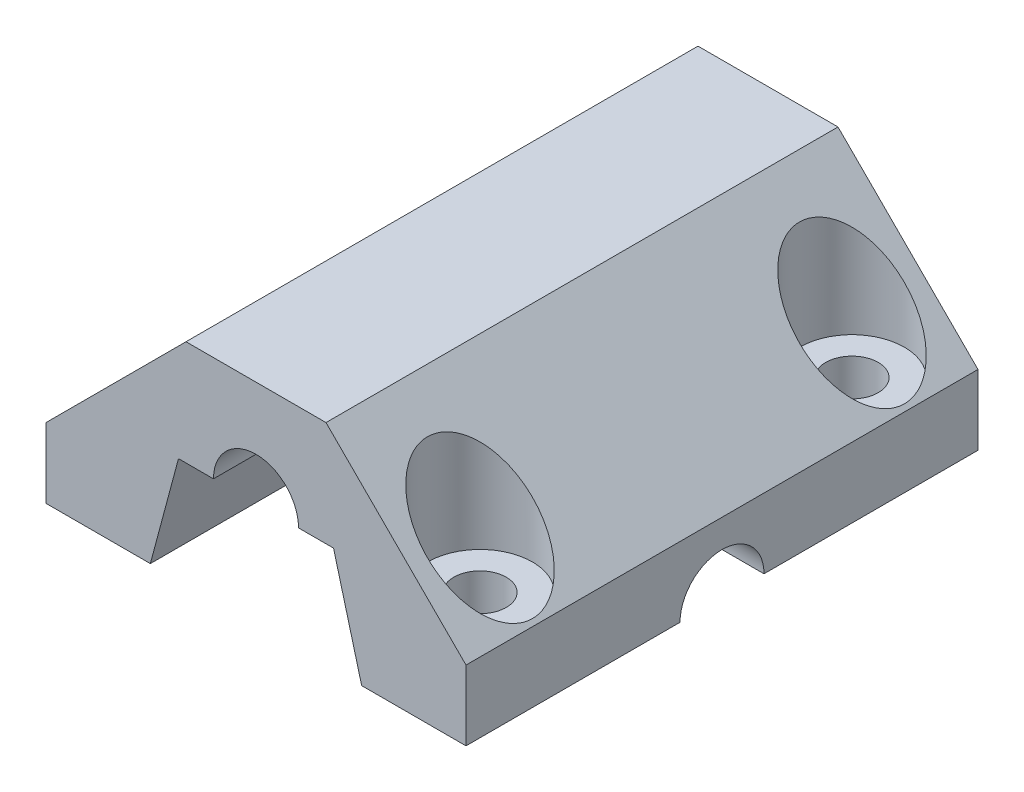
ISO-10303-21;
HEADER;
FILE_DESCRIPTION(('STEP AP214'),'2;1');
FILE_NAME('part.step','',(''),(''),'','','');
FILE_SCHEMA(('AUTOMOTIVE_DESIGN { 1 0 10303 214 1 1 1 1 }'));
ENDSEC;
DATA;
#1=APPLICATION_CONTEXT('core data for automotive mechanical design processes');
#2=APPLICATION_PROTOCOL_DEFINITION('international standard','automotive_design',2000,#1);
#3=PRODUCT_CONTEXT('',#1,'mechanical');
#4=PRODUCT('Part','Part','',(#3));
#5=PRODUCT_RELATED_PRODUCT_CATEGORY('part','',(#4));
#6=PRODUCT_DEFINITION_FORMATION('','',#4);
#7=PRODUCT_DEFINITION_CONTEXT('part definition',#1,'design');
#8=PRODUCT_DEFINITION('design','',#6,#7);
#9=PRODUCT_DEFINITION_SHAPE('','',#8);
#10=(LENGTH_UNIT() NAMED_UNIT(*) SI_UNIT(.MILLI.,.METRE.));
#11=(NAMED_UNIT(*) PLANE_ANGLE_UNIT() SI_UNIT($,.RADIAN.));
#12=(NAMED_UNIT(*) SI_UNIT($,.STERADIAN.) SOLID_ANGLE_UNIT());
#13=UNCERTAINTY_MEASURE_WITH_UNIT(LENGTH_MEASURE(1.E-05),#10,'distance_accuracy_value','');
#14=(GEOMETRIC_REPRESENTATION_CONTEXT(3) GLOBAL_UNCERTAINTY_ASSIGNED_CONTEXT((#13)) GLOBAL_UNIT_ASSIGNED_CONTEXT((#10,
#11,#12)) REPRESENTATION_CONTEXT('',''));
#15=CARTESIAN_POINT('',(0.,0.,0.));
#16=DIRECTION('',(0.,0.,1.));
#17=DIRECTION('',(1.,0.,0.));
#18=AXIS2_PLACEMENT_3D('',#15,#16,#17);
#19=CARTESIAN_POINT('',(-22.,-25.6066017177982,-26.57));
#20=DIRECTION('',(0.,1.,0.));
#21=DIRECTION('',(-1.,0.,0.));
#22=AXIS2_PLACEMENT_3D('',#19,#20,#21);
#23=CYLINDRICAL_SURFACE('',#22,3.74999999999999);
#24=CARTESIAN_POINT('',(-22.,-15.,-26.57));
#25=DIRECTION('',(0.,1.,0.));
#26=DIRECTION('',(-1.,0.,0.));
#27=AXIS2_PLACEMENT_3D('',#24,#25,#26);
#28=CIRCLE('',#27,3.74999999999999);
#29=CARTESIAN_POINT('',(-25.75,-15.,-26.57));
#30=VERTEX_POINT('',#29);
#31=EDGE_CURVE('E208',#30,#30,#28,.F.);
#32=ORIENTED_EDGE('',*,*,#31,.T.);
#33=EDGE_LOOP('',(#32));
#34=FACE_BOUND('',#33,.T.);
#35=CARTESIAN_POINT('',(-22.,-5.,-26.57));
#36=DIRECTION('',(0.,1.,0.));
#37=DIRECTION('',(-1.,0.,0.));
#38=AXIS2_PLACEMENT_3D('',#35,#36,#37);
#39=CIRCLE('',#38,3.74999999999999);
#40=CARTESIAN_POINT('',(-25.75,-5.,-26.57));
#41=VERTEX_POINT('',#40);
#42=EDGE_CURVE('E222',#41,#41,#39,.F.);
#43=ORIENTED_EDGE('',*,*,#42,.F.);
#44=EDGE_LOOP('',(#43));
#45=FACE_BOUND('',#44,.T.);
#46=ADVANCED_FACE('F33',(#34,#45),#23,.F.);
#47=CARTESIAN_POINT('',(22.,-25.6066017177982,26.57));
#48=DIRECTION('',(0.,1.,0.));
#49=DIRECTION('',(-1.,0.,0.));
#50=AXIS2_PLACEMENT_3D('',#47,#48,#49);
#51=CYLINDRICAL_SURFACE('',#50,3.75);
#52=CARTESIAN_POINT('',(22.,-15.,26.57));
#53=DIRECTION('',(0.,1.,0.));
#54=DIRECTION('',(-1.,0.,0.));
#55=AXIS2_PLACEMENT_3D('',#52,#53,#54);
#56=CIRCLE('',#55,3.75);
#57=CARTESIAN_POINT('',(18.25,-15.,26.57));
#58=VERTEX_POINT('',#57);
#59=EDGE_CURVE('E163',#58,#58,#56,.F.);
#60=ORIENTED_EDGE('',*,*,#59,.T.);
#61=EDGE_LOOP('',(#60));
#62=FACE_BOUND('',#61,.T.);
#63=CARTESIAN_POINT('',(22.,-5.,26.57));
#64=DIRECTION('',(0.,1.,0.));
#65=DIRECTION('',(-1.,0.,0.));
#66=AXIS2_PLACEMENT_3D('',#63,#64,#65);
#67=CIRCLE('',#66,3.75);
#68=CARTESIAN_POINT('',(18.25,-5.,26.57));
#69=VERTEX_POINT('',#68);
#70=EDGE_CURVE('E201',#69,#69,#67,.F.);
#71=ORIENTED_EDGE('',*,*,#70,.F.);
#72=EDGE_LOOP('',(#71));
#73=FACE_BOUND('',#72,.T.);
#74=ADVANCED_FACE('F356',(#62,#73),#51,.F.);
#75=CARTESIAN_POINT('',(30.,-15.,36.57));
#76=DIRECTION('',(0.,1.,0.));
#77=DIRECTION('',(-1.,0.,0.));
#78=AXIS2_PLACEMENT_3D('',#75,#76,#77);
#79=PLANE('',#78);
#80=ORIENTED_EDGE('',*,*,#59,.F.);
#81=EDGE_LOOP('',(#80));
#82=FACE_BOUND('',#81,.T.);
#83=DIRECTION('',(1.,0.,0.));
#84=VECTOR('',#83,1.);
#85=CARTESIAN_POINT('',(30.,-15.,36.57));
#86=LINE('',#85,#84);
#87=CARTESIAN_POINT('',(15.0942378864668,-15.,36.57));
#88=VERTEX_POINT('',#87);
#89=CARTESIAN_POINT('',(30.,-15.,36.57));
#90=VERTEX_POINT('',#89);
#91=EDGE_CURVE('E169',#88,#90,#86,.T.);
#92=ORIENTED_EDGE('',*,*,#91,.F.);
#93=DIRECTION('',(0.,0.,1.));
#94=VECTOR('',#93,1.);
#95=CARTESIAN_POINT('',(15.0942378864668,-15.,-73.3871114360294));
#96=LINE('',#95,#94);
#97=CARTESIAN_POINT('',(15.0942378864668,-15.,6.00000000000001));
#98=VERTEX_POINT('',#97);
#99=EDGE_CURVE('E284',#98,#88,#96,.T.);
#100=ORIENTED_EDGE('',*,*,#99,.F.);
#101=DIRECTION('',(1.,0.,0.));
#102=VECTOR('',#101,1.);
#103=CARTESIAN_POINT('',(-43.4164078649987,-15.,6.));
#104=LINE('',#103,#102);
#105=CARTESIAN_POINT('',(30.,-15.,6.));
#106=VERTEX_POINT('',#105);
#107=EDGE_CURVE('E301',#98,#106,#104,.T.);
#108=ORIENTED_EDGE('',*,*,#107,.T.);
#109=DIRECTION('',(0.,0.,-1.));
#110=VECTOR('',#109,1.);
#111=CARTESIAN_POINT('',(30.,-15.,36.57));
#112=LINE('',#111,#110);
#113=EDGE_CURVE('E195',#90,#106,#112,.T.);
#114=ORIENTED_EDGE('',*,*,#113,.F.);
#115=EDGE_LOOP('',(#92,#100,#108,#114));
#116=FACE_BOUND('',#115,.T.);
#117=ADVANCED_FACE('F319',(#82,#116),#79,.F.);
#118=CARTESIAN_POINT('',(22.,-15.,-26.57));
#119=DIRECTION('',(0.,1.,0.));
#120=DIRECTION('',(-1.,0.,0.));
#121=AXIS2_PLACEMENT_3D('',#118,#119,#120);
#122=CIRCLE('',#121,3.75);
#123=CARTESIAN_POINT('',(18.25,-15.,-26.57));
#124=VERTEX_POINT('',#123);
#125=EDGE_CURVE('E241',#124,#124,#122,.F.);
#126=ORIENTED_EDGE('',*,*,#125,.F.);
#127=EDGE_LOOP('',(#126));
#128=FACE_BOUND('',#127,.T.);
#129=DIRECTION('',(1.,0.,0.));
#130=VECTOR('',#129,1.);
#131=CARTESIAN_POINT('',(-43.4164078649987,-15.,-6.));
#132=LINE('',#131,#130);
#133=CARTESIAN_POINT('',(15.0942378864668,-15.,-6.00000000000001));
#134=VERTEX_POINT('',#133);
#135=CARTESIAN_POINT('',(30.,-15.,-6.));
#136=VERTEX_POINT('',#135);
#137=EDGE_CURVE('E303',#134,#136,#132,.T.);
#138=ORIENTED_EDGE('',*,*,#137,.F.);
#139=CARTESIAN_POINT('',(15.0942378864668,-15.,-36.57));
#140=VERTEX_POINT('',#139);
#141=EDGE_CURVE('E262',#140,#134,#96,.T.);
#142=ORIENTED_EDGE('',*,*,#141,.F.);
#143=DIRECTION('',(1.,0.,0.));
#144=VECTOR('',#143,1.);
#145=CARTESIAN_POINT('',(30.,-15.,-36.57));
#146=LINE('',#145,#144);
#147=CARTESIAN_POINT('',(30.,-15.,-36.57));
#148=VERTEX_POINT('',#147);
#149=EDGE_CURVE('E188',#140,#148,#146,.T.);
#150=ORIENTED_EDGE('',*,*,#149,.T.);
#151=EDGE_CURVE('E185',#136,#148,#112,.T.);
#152=ORIENTED_EDGE('',*,*,#151,.F.);
#153=EDGE_LOOP('',(#138,#142,#150,#152));
#154=FACE_BOUND('',#153,.T.);
#155=ADVANCED_FACE('F335',(#128,#154),#79,.F.);
#156=CARTESIAN_POINT('',(-43.4164078649987,-15.,0.));
#157=DIRECTION('',(1.,0.,0.));
#158=DIRECTION('',(0.,0.,-1.));
#159=AXIS2_PLACEMENT_3D('',#156,#157,#158);
#160=CYLINDRICAL_SURFACE('',#159,6.);
#161=CARTESIAN_POINT('',(15.0942378864668,-15.,0.));
#162=DIRECTION('',(0.965925826289069,0.258819045102518,0.));
#163=DIRECTION('',(0.258819045102518,-0.965925826289069,0.));
#164=AXIS2_PLACEMENT_3D('',#161,#162,#163);
#165=ELLIPSE('',#164,6.21165708246049,6.);
#166=EDGE_CURVE('E11',#134,#98,#165,.T.);
#167=ORIENTED_EDGE('',*,*,#166,.F.);
#168=ORIENTED_EDGE('',*,*,#137,.T.);
#169=CARTESIAN_POINT('',(30.,-15.,0.));
#170=DIRECTION('',(1.,0.,0.));
#171=DIRECTION('',(0.,0.,-1.));
#172=AXIS2_PLACEMENT_3D('',#169,#170,#171);
#173=CIRCLE('',#172,6.);
#174=EDGE_CURVE('E297',#106,#136,#173,.F.);
#175=ORIENTED_EDGE('',*,*,#174,.F.);
#176=ORIENTED_EDGE('',*,*,#107,.F.);
#177=EDGE_LOOP('',(#167,#168,#175,#176));
#178=FACE_BOUND('',#177,.T.);
#179=ADVANCED_FACE('F321',(#178),#160,.F.);
#180=CARTESIAN_POINT('',(-30.,-15.,36.57));
#181=DIRECTION('',(1.,0.,0.));
#182=DIRECTION('',(0.,0.,-1.));
#183=AXIS2_PLACEMENT_3D('',#180,#181,#182);
#184=PLANE('',#183);
#185=DIRECTION('',(0.,-1.,0.));
#186=VECTOR('',#185,1.);
#187=CARTESIAN_POINT('',(-30.,-15.,36.57));
#188=LINE('',#187,#186);
#189=CARTESIAN_POINT('',(-30.,-5.,36.57));
#190=VERTEX_POINT('',#189);
#191=CARTESIAN_POINT('',(-30.,-15.,36.57));
#192=VERTEX_POINT('',#191);
#193=EDGE_CURVE('E158',#190,#192,#188,.T.);
#194=ORIENTED_EDGE('',*,*,#193,.F.);
#195=DIRECTION('',(0.,0.,1.));
#196=VECTOR('',#195,1.);
#197=CARTESIAN_POINT('',(-30.,-5.,-64.8542712474619));
#198=LINE('',#197,#196);
#199=CARTESIAN_POINT('',(-30.,-5.,-36.57));
#200=VERTEX_POINT('',#199);
#201=EDGE_CURVE('E145',#200,#190,#198,.T.);
#202=ORIENTED_EDGE('',*,*,#201,.F.);
#203=DIRECTION('',(0.,-1.,0.));
#204=VECTOR('',#203,1.);
#205=CARTESIAN_POINT('',(-30.,-15.,-36.57));
#206=LINE('',#205,#204);
#207=CARTESIAN_POINT('',(-30.,-15.,-36.57));
#208=VERTEX_POINT('',#207);
#209=EDGE_CURVE('E186',#200,#208,#206,.T.);
#210=ORIENTED_EDGE('',*,*,#209,.T.);
#211=DIRECTION('',(0.,0.,-1.));
#212=VECTOR('',#211,1.);
#213=CARTESIAN_POINT('',(-30.,-15.,36.57));
#214=LINE('',#213,#212);
#215=CARTESIAN_POINT('',(-30.,-15.,-6.));
#216=VERTEX_POINT('',#215);
#217=EDGE_CURVE('E198',#216,#208,#214,.T.);
#218=ORIENTED_EDGE('',*,*,#217,.F.);
#219=CARTESIAN_POINT('',(-30.,-15.,0.));
#220=DIRECTION('',(1.,0.,0.));
#221=DIRECTION('',(0.,0.,-1.));
#222=AXIS2_PLACEMENT_3D('',#219,#220,#221);
#223=CIRCLE('',#222,6.);
#224=CARTESIAN_POINT('',(-30.,-15.,6.));
#225=VERTEX_POINT('',#224);
#226=EDGE_CURVE('E189',#216,#225,#223,.T.);
#227=ORIENTED_EDGE('',*,*,#226,.T.);
#228=EDGE_CURVE('E168',#192,#225,#214,.T.);
#229=ORIENTED_EDGE('',*,*,#228,.F.);
#230=EDGE_LOOP('',(#194,#202,#210,#218,#227,#229));
#231=FACE_BOUND('',#230,.T.);
#232=ADVANCED_FACE('F35',(#231),#184,.F.);
#233=CARTESIAN_POINT('',(-22.,-15.,26.57));
#234=DIRECTION('',(0.,1.,0.));
#235=DIRECTION('',(-1.,0.,0.));
#236=AXIS2_PLACEMENT_3D('',#233,#234,#235);
#237=CIRCLE('',#236,3.75);
#238=CARTESIAN_POINT('',(-25.75,-15.,26.57));
#239=VERTEX_POINT('',#238);
#240=EDGE_CURVE('E244',#239,#239,#237,.F.);
#241=ORIENTED_EDGE('',*,*,#240,.F.);
#242=EDGE_LOOP('',(#241));
#243=FACE_BOUND('',#242,.T.);
#244=CARTESIAN_POINT('',(-15.0942378864669,-15.,6.));
#245=VERTEX_POINT('',#244);
#246=EDGE_CURVE('E178',#225,#245,#104,.T.);
#247=ORIENTED_EDGE('',*,*,#246,.T.);
#248=DIRECTION('',(0.,0.,1.));
#249=VECTOR('',#248,1.);
#250=CARTESIAN_POINT('',(-15.0942378864669,-15.,-73.3871114360294));
#251=LINE('',#250,#249);
#252=CARTESIAN_POINT('',(-15.0942378864669,-15.,36.57));
#253=VERTEX_POINT('',#252);
#254=EDGE_CURVE('E288',#245,#253,#251,.T.);
#255=ORIENTED_EDGE('',*,*,#254,.T.);
#256=EDGE_CURVE('E172',#192,#253,#86,.T.);
#257=ORIENTED_EDGE('',*,*,#256,.F.);
#258=ORIENTED_EDGE('',*,*,#228,.T.);
#259=EDGE_LOOP('',(#247,#255,#257,#258));
#260=FACE_BOUND('',#259,.T.);
#261=ADVANCED_FACE('F563',(#243,#260),#79,.F.);
#262=ORIENTED_EDGE('',*,*,#31,.F.);
#263=EDGE_LOOP('',(#262));
#264=FACE_BOUND('',#263,.T.);
#265=CARTESIAN_POINT('',(-15.0942378864669,-15.,-36.57));
#266=VERTEX_POINT('',#265);
#267=EDGE_CURVE('E190',#208,#266,#146,.T.);
#268=ORIENTED_EDGE('',*,*,#267,.T.);
#269=CARTESIAN_POINT('',(-15.0942378864669,-15.,-6.00000000000003));
#270=VERTEX_POINT('',#269);
#271=EDGE_CURVE('E285',#266,#270,#251,.T.);
#272=ORIENTED_EDGE('',*,*,#271,.T.);
#273=EDGE_CURVE('E299',#216,#270,#132,.T.);
#274=ORIENTED_EDGE('',*,*,#273,.F.);
#275=ORIENTED_EDGE('',*,*,#217,.T.);
#276=EDGE_LOOP('',(#268,#272,#274,#275));
#277=FACE_BOUND('',#276,.T.);
#278=ADVANCED_FACE('F352',(#264,#277),#79,.F.);
#279=CARTESIAN_POINT('',(30.,-15.,36.57));
#280=DIRECTION('',(-1.,0.,0.));
#281=DIRECTION('',(0.,0.,1.));
#282=AXIS2_PLACEMENT_3D('',#279,#280,#281);
#283=PLANE('',#282);
#284=DIRECTION('',(0.,1.,0.));
#285=VECTOR('',#284,1.);
#286=CARTESIAN_POINT('',(30.,-15.,-36.57));
#287=LINE('',#286,#285);
#288=CARTESIAN_POINT('',(30.,-5.,-36.57));
#289=VERTEX_POINT('',#288);
#290=EDGE_CURVE('E175',#148,#289,#287,.T.);
#291=ORIENTED_EDGE('',*,*,#290,.T.);
#292=DIRECTION('',(0.,0.,1.));
#293=VECTOR('',#292,1.);
#294=CARTESIAN_POINT('',(30.,-5.,-64.8542712474619));
#295=LINE('',#294,#293);
#296=CARTESIAN_POINT('',(30.,-5.,36.57));
#297=VERTEX_POINT('',#296);
#298=EDGE_CURVE('E58',#289,#297,#295,.T.);
#299=ORIENTED_EDGE('',*,*,#298,.T.);
#300=DIRECTION('',(0.,1.,0.));
#301=VECTOR('',#300,1.);
#302=CARTESIAN_POINT('',(30.,-15.,36.57));
#303=LINE('',#302,#301);
#304=EDGE_CURVE('E181',#90,#297,#303,.T.);
#305=ORIENTED_EDGE('',*,*,#304,.F.);
#306=ORIENTED_EDGE('',*,*,#113,.T.);
#307=ORIENTED_EDGE('',*,*,#174,.T.);
#308=ORIENTED_EDGE('',*,*,#151,.T.);
#309=EDGE_LOOP('',(#291,#299,#305,#306,#307,#308));
#310=FACE_BOUND('',#309,.T.);
#311=ADVANCED_FACE('F325',(#310),#283,.F.);
#312=CARTESIAN_POINT('',(30.,15.,36.57));
#313=DIRECTION('',(0.,-1.,0.));
#314=DIRECTION('',(1.,0.,0.));
#315=AXIS2_PLACEMENT_3D('',#312,#313,#314);
#316=PLANE('',#315);
#317=DIRECTION('',(-1.,0.,0.));
#318=VECTOR('',#317,1.);
#319=CARTESIAN_POINT('',(30.,15.,-36.57));
#320=LINE('',#319,#318);
#321=CARTESIAN_POINT('',(10.,15.,-36.57));
#322=VERTEX_POINT('',#321);
#323=CARTESIAN_POINT('',(-9.99999999999999,15.,-36.57));
#324=VERTEX_POINT('',#323);
#325=EDGE_CURVE('E170',#322,#324,#320,.T.);
#326=ORIENTED_EDGE('',*,*,#325,.T.);
#327=DIRECTION('',(0.,0.,1.));
#328=VECTOR('',#327,1.);
#329=CARTESIAN_POINT('',(-10.,15.,-64.8542712474619));
#330=LINE('',#329,#328);
#331=CARTESIAN_POINT('',(-10.,15.,36.57));
#332=VERTEX_POINT('',#331);
#333=EDGE_CURVE('E50',#324,#332,#330,.T.);
#334=ORIENTED_EDGE('',*,*,#333,.T.);
#335=DIRECTION('',(-1.,0.,0.));
#336=VECTOR('',#335,1.);
#337=CARTESIAN_POINT('',(30.,15.,36.57));
#338=LINE('',#337,#336);
#339=CARTESIAN_POINT('',(10.,15.,36.57));
#340=VERTEX_POINT('',#339);
#341=EDGE_CURVE('E162',#340,#332,#338,.T.);
#342=ORIENTED_EDGE('',*,*,#341,.F.);
#343=DIRECTION('',(0.,0.,1.));
#344=VECTOR('',#343,1.);
#345=CARTESIAN_POINT('',(10.,15.,-64.8542712474619));
#346=LINE('',#345,#344);
#347=EDGE_CURVE('E253',#322,#340,#346,.T.);
#348=ORIENTED_EDGE('',*,*,#347,.F.);
#349=EDGE_LOOP('',(#326,#334,#342,#348));
#350=FACE_BOUND('',#349,.T.);
#351=ADVANCED_FACE('F344',(#350),#316,.F.);
#352=CARTESIAN_POINT('',(0.,0.,36.57));
#353=DIRECTION('',(0.,0.,1.));
#354=DIRECTION('',(1.,0.,0.));
#355=AXIS2_PLACEMENT_3D('',#352,#353,#354);
#356=PLANE('',#355);
#357=DIRECTION('',(0.707106781186548,0.707106781186547,0.));
#358=VECTOR('',#357,1.);
#359=CARTESIAN_POINT('',(-30.,-5.,36.57));
#360=LINE('',#359,#358);
#361=EDGE_CURVE('E148',#190,#332,#360,.T.);
#362=ORIENTED_EDGE('',*,*,#361,.F.);
#363=ORIENTED_EDGE('',*,*,#193,.T.);
#364=ORIENTED_EDGE('',*,*,#256,.T.);
#365=DIRECTION('',(-0.258819045102525,-0.965925826289067,0.));
#366=VECTOR('',#365,1.);
#367=CARTESIAN_POINT('',(-11.075,0.,36.57));
#368=LINE('',#367,#366);
#369=CARTESIAN_POINT('',(-11.075,0.,36.57));
#370=VERTEX_POINT('',#369);
#371=EDGE_CURVE('E280',#370,#253,#368,.T.);
#372=ORIENTED_EDGE('',*,*,#371,.F.);
#373=DIRECTION('',(-1.,0.,0.));
#374=VECTOR('',#373,1.);
#375=CARTESIAN_POINT('',(-6.075,0.,36.57));
#376=LINE('',#375,#374);
#377=CARTESIAN_POINT('',(-6.075,0.,36.57));
#378=VERTEX_POINT('',#377);
#379=EDGE_CURVE('E277',#378,#370,#376,.T.);
#380=ORIENTED_EDGE('',*,*,#379,.F.);
#381=CARTESIAN_POINT('',(0.,0.,36.57));
#382=DIRECTION('',(0.,0.,1.));
#383=DIRECTION('',(1.,0.,0.));
#384=AXIS2_PLACEMENT_3D('',#381,#382,#383);
#385=CIRCLE('',#384,6.075);
#386=CARTESIAN_POINT('',(6.075,0.,36.57));
#387=VERTEX_POINT('',#386);
#388=EDGE_CURVE('E274',#387,#378,#385,.T.);
#389=ORIENTED_EDGE('',*,*,#388,.F.);
#390=DIRECTION('',(-1.,0.,0.));
#391=VECTOR('',#390,1.);
#392=CARTESIAN_POINT('',(6.075,0.,36.57));
#393=LINE('',#392,#391);
#394=CARTESIAN_POINT('',(11.075,0.,36.57));
#395=VERTEX_POINT('',#394);
#396=EDGE_CURVE('E271',#395,#387,#393,.T.);
#397=ORIENTED_EDGE('',*,*,#396,.F.);
#398=DIRECTION('',(-0.258819045102518,0.965925826289069,0.));
#399=VECTOR('',#398,1.);
#400=CARTESIAN_POINT('',(11.075,0.,36.57));
#401=LINE('',#400,#399);
#402=EDGE_CURVE('E258',#88,#395,#401,.T.);
#403=ORIENTED_EDGE('',*,*,#402,.F.);
#404=ORIENTED_EDGE('',*,*,#91,.T.);
#405=ORIENTED_EDGE('',*,*,#304,.T.);
#406=DIRECTION('',(0.707106781186548,-0.707106781186547,0.));
#407=VECTOR('',#406,1.);
#408=CARTESIAN_POINT('',(30.,-5.,36.57));
#409=LINE('',#408,#407);
#410=EDGE_CURVE('E249',#340,#297,#409,.T.);
#411=ORIENTED_EDGE('',*,*,#410,.F.);
#412=ORIENTED_EDGE('',*,*,#341,.T.);
#413=EDGE_LOOP('',(#362,#363,#364,#372,#380,#389,#397,#403,#404,#405,#411,#412));
#414=FACE_BOUND('',#413,.T.);
#415=ADVANCED_FACE('F156',(#414),#356,.T.);
#416=CARTESIAN_POINT('',(0.,0.,-36.57));
#417=DIRECTION('',(0.,0.,1.));
#418=DIRECTION('',(1.,0.,0.));
#419=AXIS2_PLACEMENT_3D('',#416,#417,#418);
#420=PLANE('',#419);
#421=ORIENTED_EDGE('',*,*,#209,.F.);
#422=DIRECTION('',(-0.707106781186548,-0.707106781186548,0.));
#423=VECTOR('',#422,1.);
#424=CARTESIAN_POINT('',(-30.,-5.,-36.57));
#425=LINE('',#424,#423);
#426=EDGE_CURVE('E149',#324,#200,#425,.T.);
#427=ORIENTED_EDGE('',*,*,#426,.F.);
#428=ORIENTED_EDGE('',*,*,#325,.F.);
#429=DIRECTION('',(-0.707106781186548,0.707106781186548,0.));
#430=VECTOR('',#429,1.);
#431=CARTESIAN_POINT('',(30.,-5.,-36.57));
#432=LINE('',#431,#430);
#433=EDGE_CURVE('E255',#289,#322,#432,.T.);
#434=ORIENTED_EDGE('',*,*,#433,.F.);
#435=ORIENTED_EDGE('',*,*,#290,.F.);
#436=ORIENTED_EDGE('',*,*,#149,.F.);
#437=DIRECTION('',(0.258819045102518,-0.965925826289069,0.));
#438=VECTOR('',#437,1.);
#439=CARTESIAN_POINT('',(11.075,0.,-36.57));
#440=LINE('',#439,#438);
#441=CARTESIAN_POINT('',(11.075,0.,-36.57));
#442=VERTEX_POINT('',#441);
#443=EDGE_CURVE('E266',#442,#140,#440,.T.);
#444=ORIENTED_EDGE('',*,*,#443,.F.);
#445=DIRECTION('',(1.,0.,0.));
#446=VECTOR('',#445,1.);
#447=CARTESIAN_POINT('',(6.075,0.,-36.57));
#448=LINE('',#447,#446);
#449=CARTESIAN_POINT('',(6.075,0.,-36.57));
#450=VERTEX_POINT('',#449);
#451=EDGE_CURVE('E268',#450,#442,#448,.T.);
#452=ORIENTED_EDGE('',*,*,#451,.F.);
#453=CARTESIAN_POINT('',(0.,0.,-36.57));
#454=DIRECTION('',(0.,0.,1.));
#455=DIRECTION('',(1.,0.,0.));
#456=AXIS2_PLACEMENT_3D('',#453,#454,#455);
#457=CIRCLE('',#456,6.075);
#458=CARTESIAN_POINT('',(-6.075,0.,-36.57));
#459=VERTEX_POINT('',#458);
#460=EDGE_CURVE('E259',#459,#450,#457,.F.);
#461=ORIENTED_EDGE('',*,*,#460,.F.);
#462=DIRECTION('',(1.,0.,0.));
#463=VECTOR('',#462,1.);
#464=CARTESIAN_POINT('',(-6.075,0.,-36.57));
#465=LINE('',#464,#463);
#466=CARTESIAN_POINT('',(-11.075,0.,-36.57));
#467=VERTEX_POINT('',#466);
#468=EDGE_CURVE('E261',#467,#459,#465,.T.);
#469=ORIENTED_EDGE('',*,*,#468,.F.);
#470=DIRECTION('',(0.258819045102525,0.965925826289067,0.));
#471=VECTOR('',#470,1.);
#472=CARTESIAN_POINT('',(-11.075,0.,-36.57));
#473=LINE('',#472,#471);
#474=EDGE_CURVE('E264',#266,#467,#473,.T.);
#475=ORIENTED_EDGE('',*,*,#474,.F.);
#476=ORIENTED_EDGE('',*,*,#267,.F.);
#477=EDGE_LOOP('',(#421,#427,#428,#434,#435,#436,#444,#452,#461,#469,#475,#476));
#478=FACE_BOUND('',#477,.T.);
#479=ADVANCED_FACE('F339',(#478),#420,.F.);
#480=CARTESIAN_POINT('',(-15.0942378864669,-15.,0.));
#481=DIRECTION('',(-0.965925826289067,0.258819045102525,0.));
#482=DIRECTION('',(0.258819045102525,0.965925826289067,0.));
#483=AXIS2_PLACEMENT_3D('',#480,#481,#482);
#484=ELLIPSE('',#483,6.2116570824605,6.);
#485=EDGE_CURVE('E42',#245,#270,#484,.T.);
#486=ORIENTED_EDGE('',*,*,#485,.F.);
#487=ORIENTED_EDGE('',*,*,#246,.F.);
#488=ORIENTED_EDGE('',*,*,#226,.F.);
#489=ORIENTED_EDGE('',*,*,#273,.T.);
#490=EDGE_LOOP('',(#486,#487,#488,#489));
#491=FACE_BOUND('',#490,.T.);
#492=ADVANCED_FACE('F401',(#491),#160,.F.);
#493=CARTESIAN_POINT('',(11.075,0.,-73.3871114360294));
#494=DIRECTION('',(0.965925826289069,0.258819045102518,0.));
#495=DIRECTION('',(-0.258819045102518,0.965925826289069,0.));
#496=AXIS2_PLACEMENT_3D('',#493,#494,#495);
#497=PLANE('',#496);
#498=ORIENTED_EDGE('',*,*,#166,.T.);
#499=ORIENTED_EDGE('',*,*,#99,.T.);
#500=ORIENTED_EDGE('',*,*,#402,.T.);
#501=DIRECTION('',(0.,0.,1.));
#502=VECTOR('',#501,1.);
#503=CARTESIAN_POINT('',(11.075,0.,-73.3871114360294));
#504=LINE('',#503,#502);
#505=EDGE_CURVE('E282',#442,#395,#504,.T.);
#506=ORIENTED_EDGE('',*,*,#505,.F.);
#507=ORIENTED_EDGE('',*,*,#443,.T.);
#508=ORIENTED_EDGE('',*,*,#141,.T.);
#509=EDGE_LOOP('',(#498,#499,#500,#506,#507,#508));
#510=FACE_BOUND('',#509,.T.);
#511=ADVANCED_FACE('F331',(#510),#497,.F.);
#512=CARTESIAN_POINT('',(-11.075,0.,-73.3871114360294));
#513=DIRECTION('',(-0.965925826289067,0.258819045102525,0.));
#514=DIRECTION('',(-0.258819045102525,-0.965925826289067,0.));
#515=AXIS2_PLACEMENT_3D('',#512,#513,#514);
#516=PLANE('',#515);
#517=ORIENTED_EDGE('',*,*,#485,.T.);
#518=ORIENTED_EDGE('',*,*,#271,.F.);
#519=ORIENTED_EDGE('',*,*,#474,.T.);
#520=DIRECTION('',(0.,0.,1.));
#521=VECTOR('',#520,1.);
#522=CARTESIAN_POINT('',(-11.075,0.,-73.3871114360294));
#523=LINE('',#522,#521);
#524=EDGE_CURVE('E289',#467,#370,#523,.T.);
#525=ORIENTED_EDGE('',*,*,#524,.T.);
#526=ORIENTED_EDGE('',*,*,#371,.T.);
#527=ORIENTED_EDGE('',*,*,#254,.F.);
#528=EDGE_LOOP('',(#517,#518,#519,#525,#526,#527));
#529=FACE_BOUND('',#528,.T.);
#530=ADVANCED_FACE('F384',(#529),#516,.F.);
#531=CARTESIAN_POINT('',(-6.075,0.,-73.3871114360294));
#532=DIRECTION('',(0.,1.,0.));
#533=DIRECTION('',(-1.,0.,0.));
#534=AXIS2_PLACEMENT_3D('',#531,#532,#533);
#535=PLANE('',#534);
#536=ORIENTED_EDGE('',*,*,#468,.T.);
#537=DIRECTION('',(0.,0.,1.));
#538=VECTOR('',#537,1.);
#539=CARTESIAN_POINT('',(-6.075,0.,-73.3871114360294));
#540=LINE('',#539,#538);
#541=EDGE_CURVE('E291',#459,#378,#540,.T.);
#542=ORIENTED_EDGE('',*,*,#541,.T.);
#543=ORIENTED_EDGE('',*,*,#379,.T.);
#544=ORIENTED_EDGE('',*,*,#524,.F.);
#545=EDGE_LOOP('',(#536,#542,#543,#544));
#546=FACE_BOUND('',#545,.T.);
#547=ADVANCED_FACE('F387',(#546),#535,.F.);
#548=CARTESIAN_POINT('',(0.,0.,-73.3871114360294));
#549=DIRECTION('',(0.,0.,1.));
#550=DIRECTION('',(1.,0.,0.));
#551=AXIS2_PLACEMENT_3D('',#548,#549,#550);
#552=CYLINDRICAL_SURFACE('',#551,6.075);
#553=ORIENTED_EDGE('',*,*,#460,.T.);
#554=DIRECTION('',(0.,0.,1.));
#555=VECTOR('',#554,1.);
#556=CARTESIAN_POINT('',(6.075,0.,-73.3871114360294));
#557=LINE('',#556,#555);
#558=EDGE_CURVE('E293',#450,#387,#557,.T.);
#559=ORIENTED_EDGE('',*,*,#558,.T.);
#560=ORIENTED_EDGE('',*,*,#388,.T.);
#561=ORIENTED_EDGE('',*,*,#541,.F.);
#562=EDGE_LOOP('',(#553,#559,#560,#561));
#563=FACE_BOUND('',#562,.T.);
#564=ADVANCED_FACE('F391',(#563),#552,.F.);
#565=CARTESIAN_POINT('',(6.075,0.,-73.3871114360294));
#566=DIRECTION('',(0.,1.,0.));
#567=DIRECTION('',(0.,0.,1.));
#568=AXIS2_PLACEMENT_3D('',#565,#566,#567);
#569=PLANE('',#568);
#570=ORIENTED_EDGE('',*,*,#451,.T.);
#571=ORIENTED_EDGE('',*,*,#505,.T.);
#572=ORIENTED_EDGE('',*,*,#396,.T.);
#573=ORIENTED_EDGE('',*,*,#558,.F.);
#574=EDGE_LOOP('',(#570,#571,#572,#573));
#575=FACE_BOUND('',#574,.T.);
#576=ADVANCED_FACE('F382',(#575),#569,.F.);
#577=CARTESIAN_POINT('',(30.,-5.,-64.8542712474619));
#578=DIRECTION('',(-0.707106781186547,-0.707106781186547,0.));
#579=DIRECTION('',(0.707106781186548,-0.707106781186548,0.));
#580=AXIS2_PLACEMENT_3D('',#577,#578,#579);
#581=PLANE('',#580);
#582=CARTESIAN_POINT('',(22.,3.,-26.57));
#583=DIRECTION('',(-0.707106781186547,-0.707106781186547,0.));
#584=DIRECTION('',(-0.707106781186548,0.707106781186548,0.));
#585=AXIS2_PLACEMENT_3D('',#582,#583,#584);
#586=ELLIPSE('',#585,10.6066017177982,7.5);
#587=CARTESIAN_POINT('',(14.5,10.5,-26.57));
#588=VERTEX_POINT('',#587);
#589=EDGE_CURVE('E219',#588,#588,#586,.T.);
#590=ORIENTED_EDGE('',*,*,#589,.T.);
#591=EDGE_LOOP('',(#590));
#592=FACE_BOUND('',#591,.T.);
#593=CARTESIAN_POINT('',(22.,3.,26.57));
#594=DIRECTION('',(-0.707106781186547,-0.707106781186547,0.));
#595=DIRECTION('',(-0.707106781186548,0.707106781186548,0.));
#596=AXIS2_PLACEMENT_3D('',#593,#594,#595);
#597=ELLIPSE('',#596,10.6066017177982,7.5);
#598=CARTESIAN_POINT('',(14.5,10.5,26.57));
#599=VERTEX_POINT('',#598);
#600=EDGE_CURVE('E204',#599,#599,#597,.T.);
#601=ORIENTED_EDGE('',*,*,#600,.T.);
#602=EDGE_LOOP('',(#601));
#603=FACE_BOUND('',#602,.T.);
#604=ORIENTED_EDGE('',*,*,#433,.T.);
#605=ORIENTED_EDGE('',*,*,#347,.T.);
#606=ORIENTED_EDGE('',*,*,#410,.T.);
#607=ORIENTED_EDGE('',*,*,#298,.F.);
#608=EDGE_LOOP('',(#604,#605,#606,#607));
#609=FACE_BOUND('',#608,.T.);
#610=ADVANCED_FACE('F342',(#592,#603,#609),#581,.F.);
#611=CARTESIAN_POINT('',(-30.,-5.,-64.8542712474619));
#612=DIRECTION('',(0.707106781186547,-0.707106781186547,0.));
#613=DIRECTION('',(0.707106781186548,0.707106781186548,0.));
#614=AXIS2_PLACEMENT_3D('',#611,#612,#613);
#615=PLANE('',#614);
#616=CARTESIAN_POINT('',(-22.,3.,-26.57));
#617=DIRECTION('',(0.707106781186547,-0.707106781186547,0.));
#618=DIRECTION('',(0.707106781186548,0.707106781186548,0.));
#619=AXIS2_PLACEMENT_3D('',#616,#617,#618);
#620=ELLIPSE('',#619,10.6066017177982,7.5);
#621=CARTESIAN_POINT('',(-14.5,10.5,-26.57));
#622=VERTEX_POINT('',#621);
#623=EDGE_CURVE('E37',#622,#622,#620,.T.);
#624=ORIENTED_EDGE('',*,*,#623,.T.);
#625=EDGE_LOOP('',(#624));
#626=FACE_BOUND('',#625,.T.);
#627=CARTESIAN_POINT('',(-22.,3.,26.57));
#628=DIRECTION('',(0.707106781186547,-0.707106781186547,0.));
#629=DIRECTION('',(0.707106781186548,0.707106781186548,0.));
#630=AXIS2_PLACEMENT_3D('',#627,#628,#629);
#631=ELLIPSE('',#630,10.6066017177982,7.5);
#632=CARTESIAN_POINT('',(-14.5,10.5,26.57));
#633=VERTEX_POINT('',#632);
#634=EDGE_CURVE('E212',#633,#633,#631,.T.);
#635=ORIENTED_EDGE('',*,*,#634,.T.);
#636=EDGE_LOOP('',(#635));
#637=FACE_BOUND('',#636,.T.);
#638=ORIENTED_EDGE('',*,*,#426,.T.);
#639=ORIENTED_EDGE('',*,*,#201,.T.);
#640=ORIENTED_EDGE('',*,*,#361,.T.);
#641=ORIENTED_EDGE('',*,*,#333,.F.);
#642=EDGE_LOOP('',(#638,#639,#640,#641));
#643=FACE_BOUND('',#642,.T.);
#644=ADVANCED_FACE('F147',(#626,#637,#643),#615,.F.);
#645=CARTESIAN_POINT('',(-22.,-25.6066017177982,26.57));
#646=DIRECTION('',(0.,1.,0.));
#647=DIRECTION('',(-1.,0.,0.));
#648=AXIS2_PLACEMENT_3D('',#645,#646,#647);
#649=CYLINDRICAL_SURFACE('',#648,3.75);
#650=CARTESIAN_POINT('',(-22.,-5.,26.57));
#651=DIRECTION('',(0.,-1.,0.));
#652=DIRECTION('',(1.,0.,0.));
#653=AXIS2_PLACEMENT_3D('',#650,#651,#652);
#654=CIRCLE('',#653,3.75);
#655=CARTESIAN_POINT('',(-18.25,-5.,26.57));
#656=VERTEX_POINT('',#655);
#657=EDGE_CURVE('E209',#656,#656,#654,.F.);
#658=ORIENTED_EDGE('',*,*,#657,.T.);
#659=EDGE_LOOP('',(#658));
#660=FACE_BOUND('',#659,.T.);
#661=ORIENTED_EDGE('',*,*,#240,.T.);
#662=EDGE_LOOP('',(#661));
#663=FACE_BOUND('',#662,.T.);
#664=ADVANCED_FACE('F372',(#660,#663),#649,.F.);
#665=CARTESIAN_POINT('',(22.,-25.6066017177982,-26.57));
#666=DIRECTION('',(0.,1.,0.));
#667=DIRECTION('',(-1.,0.,0.));
#668=AXIS2_PLACEMENT_3D('',#665,#666,#667);
#669=CYLINDRICAL_SURFACE('',#668,3.75);
#670=CARTESIAN_POINT('',(22.,-5.,-26.57));
#671=DIRECTION('',(0.,-1.,0.));
#672=DIRECTION('',(1.,0.,0.));
#673=AXIS2_PLACEMENT_3D('',#670,#671,#672);
#674=CIRCLE('',#673,3.75);
#675=CARTESIAN_POINT('',(25.75,-5.,-26.57));
#676=VERTEX_POINT('',#675);
#677=EDGE_CURVE('E216',#676,#676,#674,.F.);
#678=ORIENTED_EDGE('',*,*,#677,.T.);
#679=EDGE_LOOP('',(#678));
#680=FACE_BOUND('',#679,.T.);
#681=ORIENTED_EDGE('',*,*,#125,.T.);
#682=EDGE_LOOP('',(#681));
#683=FACE_BOUND('',#682,.T.);
#684=ADVANCED_FACE('F369',(#680,#683),#669,.F.);
#685=CARTESIAN_POINT('',(22.,-5.,26.57));
#686=DIRECTION('',(0.,1.,0.));
#687=DIRECTION('',(-1.,0.,0.));
#688=AXIS2_PLACEMENT_3D('',#685,#686,#687);
#689=CYLINDRICAL_SURFACE('',#688,7.5);
#690=CARTESIAN_POINT('',(22.,-5.,26.57));
#691=DIRECTION('',(0.,1.,0.));
#692=DIRECTION('',(-1.,0.,0.));
#693=AXIS2_PLACEMENT_3D('',#690,#691,#692);
#694=CIRCLE('',#693,7.5);
#695=CARTESIAN_POINT('',(14.5,-5.,26.57));
#696=VERTEX_POINT('',#695);
#697=EDGE_CURVE('E205',#696,#696,#694,.T.);
#698=ORIENTED_EDGE('',*,*,#697,.F.);
#699=EDGE_LOOP('',(#698));
#700=FACE_BOUND('',#699,.T.);
#701=ORIENTED_EDGE('',*,*,#600,.F.);
#702=EDGE_LOOP('',(#701));
#703=FACE_BOUND('',#702,.T.);
#704=ADVANCED_FACE('F367',(#700,#703),#689,.F.);
#705=CARTESIAN_POINT('',(22.,-5.,26.57));
#706=DIRECTION('',(0.,1.,0.));
#707=DIRECTION('',(-1.,0.,0.));
#708=AXIS2_PLACEMENT_3D('',#705,#706,#707);
#709=PLANE('',#708);
#710=ORIENTED_EDGE('',*,*,#697,.T.);
#711=EDGE_LOOP('',(#710));
#712=FACE_BOUND('',#711,.T.);
#713=ORIENTED_EDGE('',*,*,#70,.T.);
#714=EDGE_LOOP('',(#713));
#715=FACE_BOUND('',#714,.T.);
#716=ADVANCED_FACE('F458',(#712,#715),#709,.T.);
#717=CARTESIAN_POINT('',(-22.,-5.,26.57));
#718=DIRECTION('',(0.,1.,0.));
#719=DIRECTION('',(-1.,0.,0.));
#720=AXIS2_PLACEMENT_3D('',#717,#718,#719);
#721=CYLINDRICAL_SURFACE('',#720,7.5);
#722=CARTESIAN_POINT('',(-22.,-5.,26.57));
#723=DIRECTION('',(0.,1.,0.));
#724=DIRECTION('',(1.,0.,0.));
#725=AXIS2_PLACEMENT_3D('',#722,#723,#724);
#726=CIRCLE('',#725,7.5);
#727=CARTESIAN_POINT('',(-14.5,-5.,26.57));
#728=VERTEX_POINT('',#727);
#729=EDGE_CURVE('E213',#728,#728,#726,.T.);
#730=ORIENTED_EDGE('',*,*,#729,.F.);
#731=EDGE_LOOP('',(#730));
#732=FACE_BOUND('',#731,.T.);
#733=ORIENTED_EDGE('',*,*,#634,.F.);
#734=EDGE_LOOP('',(#733));
#735=FACE_BOUND('',#734,.T.);
#736=ADVANCED_FACE('F465',(#732,#735),#721,.F.);
#737=CARTESIAN_POINT('',(-22.,-5.,26.57));
#738=DIRECTION('',(0.,-1.,0.));
#739=DIRECTION('',(1.,0.,0.));
#740=AXIS2_PLACEMENT_3D('',#737,#738,#739);
#741=PLANE('',#740);
#742=ORIENTED_EDGE('',*,*,#729,.T.);
#743=EDGE_LOOP('',(#742));
#744=FACE_BOUND('',#743,.T.);
#745=ORIENTED_EDGE('',*,*,#657,.F.);
#746=EDGE_LOOP('',(#745));
#747=FACE_BOUND('',#746,.T.);
#748=ADVANCED_FACE('F472',(#744,#747),#741,.F.);
#749=CARTESIAN_POINT('',(22.,-5.,-26.57));
#750=DIRECTION('',(0.,1.,0.));
#751=DIRECTION('',(-1.,0.,0.));
#752=AXIS2_PLACEMENT_3D('',#749,#750,#751);
#753=CYLINDRICAL_SURFACE('',#752,7.5);
#754=CARTESIAN_POINT('',(22.,-5.,-26.57));
#755=DIRECTION('',(0.,1.,0.));
#756=DIRECTION('',(1.,0.,0.));
#757=AXIS2_PLACEMENT_3D('',#754,#755,#756);
#758=CIRCLE('',#757,7.5);
#759=CARTESIAN_POINT('',(29.5,-5.,-26.57));
#760=VERTEX_POINT('',#759);
#761=EDGE_CURVE('E220',#760,#760,#758,.T.);
#762=ORIENTED_EDGE('',*,*,#761,.F.);
#763=EDGE_LOOP('',(#762));
#764=FACE_BOUND('',#763,.T.);
#765=ORIENTED_EDGE('',*,*,#589,.F.);
#766=EDGE_LOOP('',(#765));
#767=FACE_BOUND('',#766,.T.);
#768=ADVANCED_FACE('F480',(#764,#767),#753,.F.);
#769=CARTESIAN_POINT('',(22.,-5.,-26.57));
#770=DIRECTION('',(0.,-1.,0.));
#771=DIRECTION('',(1.,0.,0.));
#772=AXIS2_PLACEMENT_3D('',#769,#770,#771);
#773=PLANE('',#772);
#774=ORIENTED_EDGE('',*,*,#761,.T.);
#775=EDGE_LOOP('',(#774));
#776=FACE_BOUND('',#775,.T.);
#777=ORIENTED_EDGE('',*,*,#677,.F.);
#778=EDGE_LOOP('',(#777));
#779=FACE_BOUND('',#778,.T.);
#780=ADVANCED_FACE('F488',(#776,#779),#773,.F.);
#781=CARTESIAN_POINT('',(-22.,-5.,-26.57));
#782=DIRECTION('',(0.,1.,0.));
#783=DIRECTION('',(-1.,0.,0.));
#784=AXIS2_PLACEMENT_3D('',#781,#782,#783);
#785=CYLINDRICAL_SURFACE('',#784,7.5);
#786=CARTESIAN_POINT('',(-22.,-5.,-26.57));
#787=DIRECTION('',(0.,1.,0.));
#788=DIRECTION('',(-1.,0.,0.));
#789=AXIS2_PLACEMENT_3D('',#786,#787,#788);
#790=CIRCLE('',#789,7.5);
#791=CARTESIAN_POINT('',(-29.5,-5.,-26.57));
#792=VERTEX_POINT('',#791);
#793=EDGE_CURVE('E224',#792,#792,#790,.T.);
#794=ORIENTED_EDGE('',*,*,#793,.F.);
#795=EDGE_LOOP('',(#794));
#796=FACE_BOUND('',#795,.T.);
#797=ORIENTED_EDGE('',*,*,#623,.F.);
#798=EDGE_LOOP('',(#797));
#799=FACE_BOUND('',#798,.T.);
#800=ADVANCED_FACE('F496',(#796,#799),#785,.F.);
#801=CARTESIAN_POINT('',(-22.,-5.,-26.57));
#802=DIRECTION('',(0.,1.,0.));
#803=DIRECTION('',(-1.,0.,0.));
#804=AXIS2_PLACEMENT_3D('',#801,#802,#803);
#805=PLANE('',#804);
#806=ORIENTED_EDGE('',*,*,#793,.T.);
#807=EDGE_LOOP('',(#806));
#808=FACE_BOUND('',#807,.T.);
#809=ORIENTED_EDGE('',*,*,#42,.T.);
#810=EDGE_LOOP('',(#809));
#811=FACE_BOUND('',#810,.T.);
#812=ADVANCED_FACE('F504',(#808,#811),#805,.T.);
#813=CLOSED_SHELL('',(#46,#74,#117,#155,#179,#232,#261,#278,#311,#351,#415,#479,#492,#511,#530,
#547,#564,#576,#610,#644,#664,#684,#704,#716,#736,#748,#768,#780,#800,#812));
#814=MANIFOLD_SOLID_BREP('B2',#813);
#815=ADVANCED_BREP_SHAPE_REPRESENTATION('',(#18,#814),#14);
#816=SHAPE_DEFINITION_REPRESENTATION(#9,#815);
ENDSEC;
END-ISO-10303-21;
